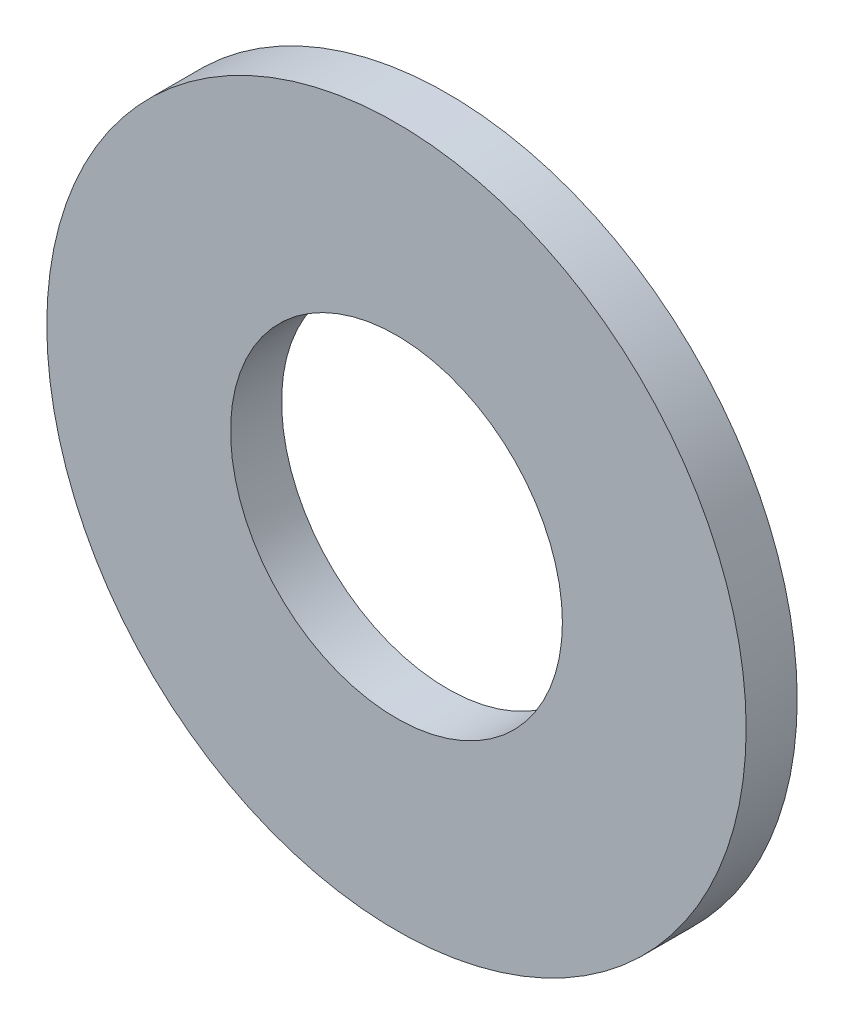
ISO-10303-21;
HEADER;
FILE_DESCRIPTION(('STEP AP214'),'2;1');
FILE_NAME('part.step','',(''),(''),'','','');
FILE_SCHEMA(('AUTOMOTIVE_DESIGN { 1 0 10303 214 1 1 1 1 }'));
ENDSEC;
DATA;
#1=APPLICATION_CONTEXT('core data for automotive mechanical design processes');
#2=APPLICATION_PROTOCOL_DEFINITION('international standard','automotive_design',2000,#1);
#3=PRODUCT_CONTEXT('',#1,'mechanical');
#4=PRODUCT('Part','Part','',(#3));
#5=PRODUCT_RELATED_PRODUCT_CATEGORY('part','',(#4));
#6=PRODUCT_DEFINITION_FORMATION('','',#4);
#7=PRODUCT_DEFINITION_CONTEXT('part definition',#1,'design');
#8=PRODUCT_DEFINITION('design','',#6,#7);
#9=PRODUCT_DEFINITION_SHAPE('','',#8);
#10=(LENGTH_UNIT() NAMED_UNIT(*) SI_UNIT(.MILLI.,.METRE.));
#11=(NAMED_UNIT(*) PLANE_ANGLE_UNIT() SI_UNIT($,.RADIAN.));
#12=(NAMED_UNIT(*) SI_UNIT($,.STERADIAN.) SOLID_ANGLE_UNIT());
#13=UNCERTAINTY_MEASURE_WITH_UNIT(LENGTH_MEASURE(1.E-05),#10,'distance_accuracy_value','');
#14=(GEOMETRIC_REPRESENTATION_CONTEXT(3) GLOBAL_UNCERTAINTY_ASSIGNED_CONTEXT((#13)) GLOBAL_UNIT_ASSIGNED_CONTEXT((#10,
#11,#12)) REPRESENTATION_CONTEXT('',''));
#15=CARTESIAN_POINT('',(0.,0.,0.));
#16=DIRECTION('',(0.,0.,1.));
#17=DIRECTION('',(1.,0.,0.));
#18=AXIS2_PLACEMENT_3D('',#15,#16,#17);
#19=CARTESIAN_POINT('',(0.,0.,0.5));
#20=DIRECTION('',(0.,0.,1.));
#21=DIRECTION('',(1.,0.,0.));
#22=AXIS2_PLACEMENT_3D('',#19,#20,#21);
#23=PLANE('',#22);
#24=CARTESIAN_POINT('',(0.,0.,0.5));
#25=DIRECTION('',(0.,0.,1.));
#26=DIRECTION('',(1.,0.,0.));
#27=AXIS2_PLACEMENT_3D('',#24,#25,#26);
#28=CIRCLE('',#27,3.425);
#29=CARTESIAN_POINT('',(3.425,0.,0.5));
#30=VERTEX_POINT('',#29);
#31=EDGE_CURVE('E10',#30,#30,#28,.T.);
#32=ORIENTED_EDGE('',*,*,#31,.T.);
#33=EDGE_LOOP('',(#32));
#34=FACE_BOUND('',#33,.T.);
#35=CARTESIAN_POINT('',(0.,0.,0.5));
#36=DIRECTION('',(0.,0.,1.));
#37=DIRECTION('',(1.,0.,0.));
#38=AXIS2_PLACEMENT_3D('',#35,#36,#37);
#39=CIRCLE('',#38,1.625);
#40=CARTESIAN_POINT('',(1.625,0.,0.5));
#41=VERTEX_POINT('',#40);
#42=EDGE_CURVE('E46',#41,#41,#39,.T.);
#43=ORIENTED_EDGE('',*,*,#42,.F.);
#44=EDGE_LOOP('',(#43));
#45=FACE_BOUND('',#44,.T.);
#46=ADVANCED_FACE('F35',(#34,#45),#23,.T.);
#47=CARTESIAN_POINT('',(0.,0.,0.));
#48=DIRECTION('',(0.,0.,1.));
#49=DIRECTION('',(1.,0.,0.));
#50=AXIS2_PLACEMENT_3D('',#47,#48,#49);
#51=PLANE('',#50);
#52=CARTESIAN_POINT('',(0.,0.,0.));
#53=DIRECTION('',(0.,0.,1.));
#54=DIRECTION('',(1.,0.,0.));
#55=AXIS2_PLACEMENT_3D('',#52,#53,#54);
#56=CIRCLE('',#55,3.425);
#57=CARTESIAN_POINT('',(3.425,0.,0.));
#58=VERTEX_POINT('',#57);
#59=EDGE_CURVE('E39',#58,#58,#56,.T.);
#60=ORIENTED_EDGE('',*,*,#59,.F.);
#61=EDGE_LOOP('',(#60));
#62=FACE_BOUND('',#61,.T.);
#63=CARTESIAN_POINT('',(0.,0.,0.));
#64=DIRECTION('',(0.,0.,1.));
#65=DIRECTION('',(1.,0.,0.));
#66=AXIS2_PLACEMENT_3D('',#63,#64,#65);
#67=CIRCLE('',#66,1.625);
#68=CARTESIAN_POINT('',(1.625,0.,0.));
#69=VERTEX_POINT('',#68);
#70=EDGE_CURVE('E48',#69,#69,#67,.T.);
#71=ORIENTED_EDGE('',*,*,#70,.T.);
#72=EDGE_LOOP('',(#71));
#73=FACE_BOUND('',#72,.T.);
#74=ADVANCED_FACE('F58',(#62,#73),#51,.F.);
#75=CARTESIAN_POINT('',(0.,0.,0.5));
#76=DIRECTION('',(0.,0.,-1.));
#77=DIRECTION('',(-1.,0.,0.));
#78=AXIS2_PLACEMENT_3D('',#75,#76,#77);
#79=CYLINDRICAL_SURFACE('',#78,3.425);
#80=ORIENTED_EDGE('',*,*,#31,.F.);
#81=EDGE_LOOP('',(#80));
#82=FACE_BOUND('',#81,.T.);
#83=ORIENTED_EDGE('',*,*,#59,.T.);
#84=EDGE_LOOP('',(#83));
#85=FACE_BOUND('',#84,.T.);
#86=ADVANCED_FACE('F37',(#82,#85),#79,.T.);
#87=CARTESIAN_POINT('',(0.,0.,0.5));
#88=DIRECTION('',(0.,0.,-1.));
#89=DIRECTION('',(-1.,0.,0.));
#90=AXIS2_PLACEMENT_3D('',#87,#88,#89);
#91=CYLINDRICAL_SURFACE('',#90,1.625);
#92=ORIENTED_EDGE('',*,*,#42,.T.);
#93=EDGE_LOOP('',(#92));
#94=FACE_BOUND('',#93,.T.);
#95=ORIENTED_EDGE('',*,*,#70,.F.);
#96=EDGE_LOOP('',(#95));
#97=FACE_BOUND('',#96,.T.);
#98=ADVANCED_FACE('F54',(#94,#97),#91,.F.);
#99=CLOSED_SHELL('',(#46,#74,#86,#98));
#100=MANIFOLD_SOLID_BREP('B2',#99);
#101=ADVANCED_BREP_SHAPE_REPRESENTATION('',(#18,#100),#14);
#102=SHAPE_DEFINITION_REPRESENTATION(#9,#101);
ENDSEC;
END-ISO-10303-21;
